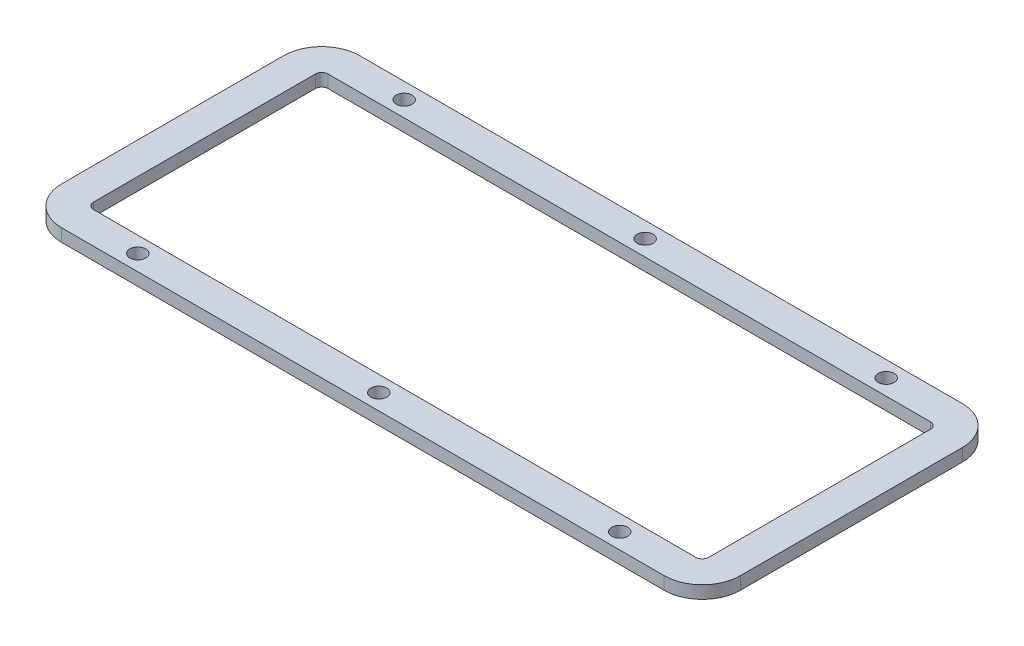
ISO-10303-21;
HEADER;
FILE_DESCRIPTION(('STEP AP214'),'2;1');
FILE_NAME('part.step','',(''),(''),'','','');
FILE_SCHEMA(('AUTOMOTIVE_DESIGN { 1 0 10303 214 1 1 1 1 }'));
ENDSEC;
DATA;
#1=APPLICATION_CONTEXT('core data for automotive mechanical design processes');
#2=APPLICATION_PROTOCOL_DEFINITION('international standard','automotive_design',2000,#1);
#3=PRODUCT_CONTEXT('',#1,'mechanical');
#4=PRODUCT('Part','Part','',(#3));
#5=PRODUCT_RELATED_PRODUCT_CATEGORY('part','',(#4));
#6=PRODUCT_DEFINITION_FORMATION('','',#4);
#7=PRODUCT_DEFINITION_CONTEXT('part definition',#1,'design');
#8=PRODUCT_DEFINITION('design','',#6,#7);
#9=PRODUCT_DEFINITION_SHAPE('','',#8);
#10=(LENGTH_UNIT() NAMED_UNIT(*) SI_UNIT(.MILLI.,.METRE.));
#11=(NAMED_UNIT(*) PLANE_ANGLE_UNIT() SI_UNIT($,.RADIAN.));
#12=(NAMED_UNIT(*) SI_UNIT($,.STERADIAN.) SOLID_ANGLE_UNIT());
#13=UNCERTAINTY_MEASURE_WITH_UNIT(LENGTH_MEASURE(1.E-05),#10,'distance_accuracy_value','');
#14=(GEOMETRIC_REPRESENTATION_CONTEXT(3) GLOBAL_UNCERTAINTY_ASSIGNED_CONTEXT((#13)) GLOBAL_UNIT_ASSIGNED_CONTEXT((#10,
#11,#12)) REPRESENTATION_CONTEXT('',''));
#15=CARTESIAN_POINT('',(0.,0.,0.));
#16=DIRECTION('',(0.,0.,1.));
#17=DIRECTION('',(1.,0.,0.));
#18=AXIS2_PLACEMENT_3D('',#15,#16,#17);
#19=CARTESIAN_POINT('',(-169.8625,3.175,74.6125));
#20=DIRECTION('',(0.,1.,0.));
#21=DIRECTION('',(0.,0.,1.));
#22=AXIS2_PLACEMENT_3D('',#19,#20,#21);
#23=PLANE('',#22);
#24=DIRECTION('',(0.,0.,-1.));
#25=VECTOR('',#24,1.);
#26=CARTESIAN_POINT('',(-153.9875,3.175,58.7375));
#27=LINE('',#26,#25);
#28=CARTESIAN_POINT('',(-153.9875,3.175,-55.5625));
#29=VERTEX_POINT('',#28);
#30=CARTESIAN_POINT('',(-153.9875,3.175,55.5625));
#31=VERTEX_POINT('',#30);
#32=EDGE_CURVE('E162',#29,#31,#27,.F.);
#33=ORIENTED_EDGE('',*,*,#32,.F.);
#34=CARTESIAN_POINT('',(-150.8125,3.175,-55.5625));
#35=DIRECTION('',(0.,1.,0.));
#36=DIRECTION('',(0.,0.,1.));
#37=AXIS2_PLACEMENT_3D('',#34,#35,#36);
#38=CIRCLE('',#37,3.175);
#39=CARTESIAN_POINT('',(-150.8125,3.175,-58.7375));
#40=VERTEX_POINT('',#39);
#41=EDGE_CURVE('E161',#29,#40,#38,.F.);
#42=ORIENTED_EDGE('',*,*,#41,.T.);
#43=DIRECTION('',(1.,0.,0.));
#44=VECTOR('',#43,1.);
#45=CARTESIAN_POINT('',(-153.9875,3.175,-58.7375));
#46=LINE('',#45,#44);
#47=CARTESIAN_POINT('',(150.8125,3.175,-58.7375));
#48=VERTEX_POINT('',#47);
#49=EDGE_CURVE('E158',#48,#40,#46,.F.);
#50=ORIENTED_EDGE('',*,*,#49,.F.);
#51=CARTESIAN_POINT('',(150.8125,3.175,-55.5625));
#52=DIRECTION('',(0.,1.,0.));
#53=DIRECTION('',(0.,0.,1.));
#54=AXIS2_PLACEMENT_3D('',#51,#52,#53);
#55=CIRCLE('',#54,3.175);
#56=CARTESIAN_POINT('',(153.9875,3.175,-55.5625));
#57=VERTEX_POINT('',#56);
#58=EDGE_CURVE('E227',#48,#57,#55,.F.);
#59=ORIENTED_EDGE('',*,*,#58,.T.);
#60=DIRECTION('',(0.,0.,1.));
#61=VECTOR('',#60,1.);
#62=CARTESIAN_POINT('',(153.9875,3.175,-58.7375));
#63=LINE('',#62,#61);
#64=CARTESIAN_POINT('',(153.9875,3.175,55.5625));
#65=VERTEX_POINT('',#64);
#66=EDGE_CURVE('E155',#65,#57,#63,.F.);
#67=ORIENTED_EDGE('',*,*,#66,.F.);
#68=CARTESIAN_POINT('',(150.8125,3.175,55.5625));
#69=DIRECTION('',(0.,1.,0.));
#70=DIRECTION('',(0.,0.,1.));
#71=AXIS2_PLACEMENT_3D('',#68,#69,#70);
#72=CIRCLE('',#71,3.175);
#73=CARTESIAN_POINT('',(150.8125,3.175,58.7375));
#74=VERTEX_POINT('',#73);
#75=EDGE_CURVE('E169',#65,#74,#72,.F.);
#76=ORIENTED_EDGE('',*,*,#75,.T.);
#77=DIRECTION('',(-1.,0.,0.));
#78=VECTOR('',#77,1.);
#79=CARTESIAN_POINT('',(153.9875,3.175,58.7375));
#80=LINE('',#79,#78);
#81=CARTESIAN_POINT('',(-150.8125,3.175,58.7375));
#82=VERTEX_POINT('',#81);
#83=EDGE_CURVE('E166',#82,#74,#80,.F.);
#84=ORIENTED_EDGE('',*,*,#83,.F.);
#85=CARTESIAN_POINT('',(-150.8125,3.175,55.5625));
#86=DIRECTION('',(0.,1.,0.));
#87=DIRECTION('',(0.,0.,1.));
#88=AXIS2_PLACEMENT_3D('',#85,#86,#87);
#89=CIRCLE('',#88,3.175);
#90=EDGE_CURVE('E165',#82,#31,#89,.F.);
#91=ORIENTED_EDGE('',*,*,#90,.T.);
#92=EDGE_LOOP('',(#33,#42,#50,#59,#67,#76,#84,#91));
#93=FACE_BOUND('',#92,.T.);
#94=DIRECTION('',(0.,0.,-1.));
#95=VECTOR('',#94,1.);
#96=CARTESIAN_POINT('',(-169.8625,3.175,74.6125));
#97=LINE('',#96,#95);
#98=CARTESIAN_POINT('',(-169.8625,3.175,-55.5625));
#99=VERTEX_POINT('',#98);
#100=CARTESIAN_POINT('',(-169.8625,3.175,55.5625));
#101=VERTEX_POINT('',#100);
#102=EDGE_CURVE('E177',#99,#101,#97,.F.);
#103=ORIENTED_EDGE('',*,*,#102,.T.);
#104=CARTESIAN_POINT('',(-150.8125,3.175,55.5625));
#105=DIRECTION('',(0.,-1.,0.));
#106=DIRECTION('',(0.,0.,-1.));
#107=AXIS2_PLACEMENT_3D('',#104,#105,#106);
#108=CIRCLE('',#107,19.05);
#109=CARTESIAN_POINT('',(-150.8125,3.175,74.6124999999999));
#110=VERTEX_POINT('',#109);
#111=EDGE_CURVE('E178',#110,#101,#108,.T.);
#112=ORIENTED_EDGE('',*,*,#111,.F.);
#113=DIRECTION('',(-1.,0.,0.));
#114=VECTOR('',#113,1.);
#115=CARTESIAN_POINT('',(169.8625,3.175,74.6125));
#116=LINE('',#115,#114);
#117=CARTESIAN_POINT('',(150.8125,3.175,74.6125));
#118=VERTEX_POINT('',#117);
#119=EDGE_CURVE('E172',#110,#118,#116,.F.);
#120=ORIENTED_EDGE('',*,*,#119,.T.);
#121=CARTESIAN_POINT('',(150.8125,3.175,55.5625));
#122=DIRECTION('',(0.,-1.,0.));
#123=DIRECTION('',(0.,0.,-1.));
#124=AXIS2_PLACEMENT_3D('',#121,#122,#123);
#125=CIRCLE('',#124,19.05);
#126=CARTESIAN_POINT('',(169.8625,3.175,55.5625));
#127=VERTEX_POINT('',#126);
#128=EDGE_CURVE('E175',#127,#118,#125,.T.);
#129=ORIENTED_EDGE('',*,*,#128,.F.);
#130=DIRECTION('',(0.,0.,1.));
#131=VECTOR('',#130,1.);
#132=CARTESIAN_POINT('',(169.8625,3.175,-74.6125));
#133=LINE('',#132,#131);
#134=CARTESIAN_POINT('',(169.8625,3.175,-55.5625));
#135=VERTEX_POINT('',#134);
#136=EDGE_CURVE('E133',#127,#135,#133,.F.);
#137=ORIENTED_EDGE('',*,*,#136,.T.);
#138=CARTESIAN_POINT('',(150.8125,3.175,-55.5625));
#139=DIRECTION('',(0.,-1.,0.));
#140=DIRECTION('',(0.,0.,-1.));
#141=AXIS2_PLACEMENT_3D('',#138,#139,#140);
#142=CIRCLE('',#141,19.05);
#143=CARTESIAN_POINT('',(150.8125,3.175,-74.6125));
#144=VERTEX_POINT('',#143);
#145=EDGE_CURVE('E126',#144,#135,#142,.T.);
#146=ORIENTED_EDGE('',*,*,#145,.F.);
#147=DIRECTION('',(1.,0.,0.));
#148=VECTOR('',#147,1.);
#149=CARTESIAN_POINT('',(-169.8625,3.175,-74.6125));
#150=LINE('',#149,#148);
#151=CARTESIAN_POINT('',(-150.8125,3.175,-74.6125));
#152=VERTEX_POINT('',#151);
#153=EDGE_CURVE('E130',#144,#152,#150,.F.);
#154=ORIENTED_EDGE('',*,*,#153,.T.);
#155=CARTESIAN_POINT('',(-150.8125,3.175,-55.5625));
#156=DIRECTION('',(0.,-1.,0.));
#157=DIRECTION('',(0.,0.,-1.));
#158=AXIS2_PLACEMENT_3D('',#155,#156,#157);
#159=CIRCLE('',#158,19.05);
#160=EDGE_CURVE('E146',#99,#152,#159,.T.);
#161=ORIENTED_EDGE('',*,*,#160,.F.);
#162=EDGE_LOOP('',(#103,#112,#120,#129,#137,#146,#154,#161));
#163=FACE_BOUND('',#162,.T.);
#164=CARTESIAN_POINT('',(-120.6373,3.17499999999998,66.6877));
#165=DIRECTION('',(0.,1.,0.));
#166=DIRECTION('',(0.,0.,1.));
#167=AXIS2_PLACEMENT_3D('',#164,#165,#166);
#168=CIRCLE('',#167,3.9751);
#169=CARTESIAN_POINT('',(-120.6373,3.17499999999998,70.6628));
#170=VERTEX_POINT('',#169);
#171=EDGE_CURVE('E139',#170,#170,#168,.F.);
#172=ORIENTED_EDGE('',*,*,#171,.T.);
#173=EDGE_LOOP('',(#172));
#174=FACE_BOUND('',#173,.T.);
#175=CARTESIAN_POINT('',(-0.0126999999999868,3.17499999999998,66.6877));
#176=DIRECTION('',(0.,1.,0.));
#177=DIRECTION('',(0.,0.,1.));
#178=AXIS2_PLACEMENT_3D('',#175,#176,#177);
#179=CIRCLE('',#178,3.9751);
#180=CARTESIAN_POINT('',(-0.0126999999999868,3.17499999999998,70.6628));
#181=VERTEX_POINT('',#180);
#182=EDGE_CURVE('E246',#181,#181,#179,.F.);
#183=ORIENTED_EDGE('',*,*,#182,.T.);
#184=EDGE_LOOP('',(#183));
#185=FACE_BOUND('',#184,.T.);
#186=CARTESIAN_POINT('',(-0.0126999999999697,3.17499999999998,-66.6623));
#187=DIRECTION('',(0.,1.,0.));
#188=DIRECTION('',(0.,0.,1.));
#189=AXIS2_PLACEMENT_3D('',#186,#187,#188);
#190=CIRCLE('',#189,3.9751);
#191=CARTESIAN_POINT('',(-0.0126999999999697,3.17499999999998,-62.6872));
#192=VERTEX_POINT('',#191);
#193=EDGE_CURVE('E249',#192,#192,#190,.F.);
#194=ORIENTED_EDGE('',*,*,#193,.T.);
#195=EDGE_LOOP('',(#194));
#196=FACE_BOUND('',#195,.T.);
#197=CARTESIAN_POINT('',(-120.6373,3.17499999999998,-66.6623));
#198=DIRECTION('',(0.,1.,0.));
#199=DIRECTION('',(0.,0.,1.));
#200=AXIS2_PLACEMENT_3D('',#197,#198,#199);
#201=CIRCLE('',#200,3.9751);
#202=CARTESIAN_POINT('',(-120.6373,3.17499999999998,-62.6872));
#203=VERTEX_POINT('',#202);
#204=EDGE_CURVE('E252',#203,#203,#201,.F.);
#205=ORIENTED_EDGE('',*,*,#204,.T.);
#206=EDGE_LOOP('',(#205));
#207=FACE_BOUND('',#206,.T.);
#208=CARTESIAN_POINT('',(120.6373,3.17499999999998,-66.6623));
#209=DIRECTION('',(0.,1.,0.));
#210=DIRECTION('',(0.,0.,1.));
#211=AXIS2_PLACEMENT_3D('',#208,#209,#210);
#212=CIRCLE('',#211,3.9751);
#213=CARTESIAN_POINT('',(120.6373,3.17499999999998,-62.6872));
#214=VERTEX_POINT('',#213);
#215=EDGE_CURVE('E254',#214,#214,#212,.F.);
#216=ORIENTED_EDGE('',*,*,#215,.T.);
#217=EDGE_LOOP('',(#216));
#218=FACE_BOUND('',#217,.T.);
#219=CARTESIAN_POINT('',(120.6373,3.17499999999998,66.6877));
#220=DIRECTION('',(0.,1.,0.));
#221=DIRECTION('',(0.,0.,1.));
#222=AXIS2_PLACEMENT_3D('',#219,#220,#221);
#223=CIRCLE('',#222,3.9751);
#224=CARTESIAN_POINT('',(120.6373,3.17499999999998,70.6628));
#225=VERTEX_POINT('',#224);
#226=EDGE_CURVE('E19',#225,#225,#223,.F.);
#227=ORIENTED_EDGE('',*,*,#226,.T.);
#228=EDGE_LOOP('',(#227));
#229=FACE_BOUND('',#228,.T.);
#230=ADVANCED_FACE('F16',(#93,#163,#174,#185,#196,#207,#218,#229),#23,.T.);
#231=CARTESIAN_POINT('',(120.6373,367.933473023724,66.6877));
#232=DIRECTION('',(0.,1.,0.));
#233=DIRECTION('',(0.,0.,1.));
#234=AXIS2_PLACEMENT_3D('',#231,#232,#233);
#235=CYLINDRICAL_SURFACE('',#234,3.9751);
#236=ORIENTED_EDGE('',*,*,#226,.F.);
#237=EDGE_LOOP('',(#236));
#238=FACE_BOUND('',#237,.T.);
#239=CARTESIAN_POINT('',(120.6373,-3.17499999999998,66.6877));
#240=DIRECTION('',(0.,1.,0.));
#241=DIRECTION('',(0.,0.,1.));
#242=AXIS2_PLACEMENT_3D('',#239,#240,#241);
#243=CIRCLE('',#242,3.9751);
#244=CARTESIAN_POINT('',(120.6373,-3.17499999999998,70.6628));
#245=VERTEX_POINT('',#244);
#246=EDGE_CURVE('E224',#245,#245,#243,.F.);
#247=ORIENTED_EDGE('',*,*,#246,.T.);
#248=EDGE_LOOP('',(#247));
#249=FACE_BOUND('',#248,.T.);
#250=ADVANCED_FACE('F262',(#238,#249),#235,.F.);
#251=CARTESIAN_POINT('',(120.6373,367.933473023724,-66.6623));
#252=DIRECTION('',(0.,1.,0.));
#253=DIRECTION('',(0.,0.,1.));
#254=AXIS2_PLACEMENT_3D('',#251,#252,#253);
#255=CYLINDRICAL_SURFACE('',#254,3.9751);
#256=ORIENTED_EDGE('',*,*,#215,.F.);
#257=EDGE_LOOP('',(#256));
#258=FACE_BOUND('',#257,.T.);
#259=CARTESIAN_POINT('',(120.6373,-3.17499999999998,-66.6623));
#260=DIRECTION('',(0.,1.,0.));
#261=DIRECTION('',(0.,0.,1.));
#262=AXIS2_PLACEMENT_3D('',#259,#260,#261);
#263=CIRCLE('',#262,3.9751);
#264=CARTESIAN_POINT('',(120.6373,-3.17499999999998,-62.6872));
#265=VERTEX_POINT('',#264);
#266=EDGE_CURVE('E221',#265,#265,#263,.F.);
#267=ORIENTED_EDGE('',*,*,#266,.T.);
#268=EDGE_LOOP('',(#267));
#269=FACE_BOUND('',#268,.T.);
#270=ADVANCED_FACE('F265',(#258,#269),#255,.F.);
#271=CARTESIAN_POINT('',(-120.6373,367.933473023724,-66.6623));
#272=DIRECTION('',(0.,1.,0.));
#273=DIRECTION('',(0.,0.,1.));
#274=AXIS2_PLACEMENT_3D('',#271,#272,#273);
#275=CYLINDRICAL_SURFACE('',#274,3.9751);
#276=ORIENTED_EDGE('',*,*,#204,.F.);
#277=EDGE_LOOP('',(#276));
#278=FACE_BOUND('',#277,.T.);
#279=CARTESIAN_POINT('',(-120.6373,-3.17499999999998,-66.6623));
#280=DIRECTION('',(0.,1.,0.));
#281=DIRECTION('',(0.,0.,1.));
#282=AXIS2_PLACEMENT_3D('',#279,#280,#281);
#283=CIRCLE('',#282,3.9751);
#284=CARTESIAN_POINT('',(-120.6373,-3.17499999999998,-62.6872));
#285=VERTEX_POINT('',#284);
#286=EDGE_CURVE('E218',#285,#285,#283,.F.);
#287=ORIENTED_EDGE('',*,*,#286,.T.);
#288=EDGE_LOOP('',(#287));
#289=FACE_BOUND('',#288,.T.);
#290=ADVANCED_FACE('F348',(#278,#289),#275,.F.);
#291=CARTESIAN_POINT('',(-0.0126999999999697,367.933473023724,-66.6623));
#292=DIRECTION('',(0.,1.,0.));
#293=DIRECTION('',(0.,0.,1.));
#294=AXIS2_PLACEMENT_3D('',#291,#292,#293);
#295=CYLINDRICAL_SURFACE('',#294,3.9751);
#296=ORIENTED_EDGE('',*,*,#193,.F.);
#297=EDGE_LOOP('',(#296));
#298=FACE_BOUND('',#297,.T.);
#299=CARTESIAN_POINT('',(-0.0126999999999697,-3.17499999999998,-66.6623));
#300=DIRECTION('',(0.,1.,0.));
#301=DIRECTION('',(0.,0.,1.));
#302=AXIS2_PLACEMENT_3D('',#299,#300,#301);
#303=CIRCLE('',#302,3.9751);
#304=CARTESIAN_POINT('',(-0.0126999999999697,-3.17499999999998,-62.6872));
#305=VERTEX_POINT('',#304);
#306=EDGE_CURVE('E215',#305,#305,#303,.F.);
#307=ORIENTED_EDGE('',*,*,#306,.T.);
#308=EDGE_LOOP('',(#307));
#309=FACE_BOUND('',#308,.T.);
#310=ADVANCED_FACE('F344',(#298,#309),#295,.F.);
#311=CARTESIAN_POINT('',(-0.0126999999999868,367.933473023724,66.6877));
#312=DIRECTION('',(0.,1.,0.));
#313=DIRECTION('',(0.,0.,1.));
#314=AXIS2_PLACEMENT_3D('',#311,#312,#313);
#315=CYLINDRICAL_SURFACE('',#314,3.9751);
#316=ORIENTED_EDGE('',*,*,#182,.F.);
#317=EDGE_LOOP('',(#316));
#318=FACE_BOUND('',#317,.T.);
#319=CARTESIAN_POINT('',(-0.0126999999999868,-3.17499999999998,66.6877));
#320=DIRECTION('',(0.,1.,0.));
#321=DIRECTION('',(0.,0.,1.));
#322=AXIS2_PLACEMENT_3D('',#319,#320,#321);
#323=CIRCLE('',#322,3.9751);
#324=CARTESIAN_POINT('',(-0.0126999999999868,-3.17499999999998,70.6628));
#325=VERTEX_POINT('',#324);
#326=EDGE_CURVE('E212',#325,#325,#323,.F.);
#327=ORIENTED_EDGE('',*,*,#326,.T.);
#328=EDGE_LOOP('',(#327));
#329=FACE_BOUND('',#328,.T.);
#330=ADVANCED_FACE('F340',(#318,#329),#315,.F.);
#331=CARTESIAN_POINT('',(-120.6373,367.933473023724,66.6877));
#332=DIRECTION('',(0.,1.,0.));
#333=DIRECTION('',(0.,0.,1.));
#334=AXIS2_PLACEMENT_3D('',#331,#332,#333);
#335=CYLINDRICAL_SURFACE('',#334,3.9751);
#336=ORIENTED_EDGE('',*,*,#171,.F.);
#337=EDGE_LOOP('',(#336));
#338=FACE_BOUND('',#337,.T.);
#339=CARTESIAN_POINT('',(-120.6373,-3.17499999999998,66.6877));
#340=DIRECTION('',(0.,1.,0.));
#341=DIRECTION('',(0.,0.,1.));
#342=AXIS2_PLACEMENT_3D('',#339,#340,#341);
#343=CIRCLE('',#342,3.9751);
#344=CARTESIAN_POINT('',(-120.6373,-3.17499999999998,70.6628));
#345=VERTEX_POINT('',#344);
#346=EDGE_CURVE('E209',#345,#345,#343,.F.);
#347=ORIENTED_EDGE('',*,*,#346,.T.);
#348=EDGE_LOOP('',(#347));
#349=FACE_BOUND('',#348,.T.);
#350=ADVANCED_FACE('F337',(#338,#349),#335,.F.);
#351=CARTESIAN_POINT('',(150.8125,-3.175,-55.5625));
#352=DIRECTION('',(0.,-1.,0.));
#353=DIRECTION('',(0.,0.,-1.));
#354=AXIS2_PLACEMENT_3D('',#351,#352,#353);
#355=CYLINDRICAL_SURFACE('',#354,19.05);
#356=ORIENTED_EDGE('',*,*,#145,.T.);
#357=DIRECTION('',(0.,1.,0.));
#358=VECTOR('',#357,1.);
#359=CARTESIAN_POINT('',(169.8625,-3.175,-55.5625));
#360=LINE('',#359,#358);
#361=CARTESIAN_POINT('',(169.8625,-3.175,-55.5625));
#362=VERTEX_POINT('',#361);
#363=EDGE_CURVE('E578',#135,#362,#360,.F.);
#364=ORIENTED_EDGE('',*,*,#363,.T.);
#365=CARTESIAN_POINT('',(150.8125,-3.175,-55.5625));
#366=DIRECTION('',(0.,-1.,0.));
#367=DIRECTION('',(0.,0.,-1.));
#368=AXIS2_PLACEMENT_3D('',#365,#366,#367);
#369=CIRCLE('',#368,19.05);
#370=CARTESIAN_POINT('',(150.8125,-3.175,-74.6125));
#371=VERTEX_POINT('',#370);
#372=EDGE_CURVE('E150',#362,#371,#369,.F.);
#373=ORIENTED_EDGE('',*,*,#372,.T.);
#374=DIRECTION('',(0.,1.,0.));
#375=VECTOR('',#374,1.);
#376=CARTESIAN_POINT('',(150.8125,-3.175,-74.6125));
#377=LINE('',#376,#375);
#378=EDGE_CURVE('E138',#371,#144,#377,.T.);
#379=ORIENTED_EDGE('',*,*,#378,.T.);
#380=EDGE_LOOP('',(#356,#364,#373,#379));
#381=FACE_BOUND('',#380,.T.);
#382=ADVANCED_FACE('F149',(#381),#355,.T.);
#383=CARTESIAN_POINT('',(-169.8625,-3.175,-74.6125));
#384=DIRECTION('',(0.,0.,1.));
#385=DIRECTION('',(1.,0.,0.));
#386=AXIS2_PLACEMENT_3D('',#383,#384,#385);
#387=PLANE('',#386);
#388=ORIENTED_EDGE('',*,*,#378,.F.);
#389=DIRECTION('',(1.,0.,0.));
#390=VECTOR('',#389,1.);
#391=CARTESIAN_POINT('',(-169.8625,-3.175,-74.6125));
#392=LINE('',#391,#390);
#393=CARTESIAN_POINT('',(-150.8125,-3.175,-74.6125));
#394=VERTEX_POINT('',#393);
#395=EDGE_CURVE('E207',#371,#394,#392,.F.);
#396=ORIENTED_EDGE('',*,*,#395,.T.);
#397=DIRECTION('',(0.,-1.,0.));
#398=VECTOR('',#397,1.);
#399=CARTESIAN_POINT('',(-150.8125,-3.175,-74.6125));
#400=LINE('',#399,#398);
#401=EDGE_CURVE('E145',#152,#394,#400,.T.);
#402=ORIENTED_EDGE('',*,*,#401,.F.);
#403=ORIENTED_EDGE('',*,*,#153,.F.);
#404=EDGE_LOOP('',(#388,#396,#402,#403));
#405=FACE_BOUND('',#404,.T.);
#406=ADVANCED_FACE('F142',(#405),#387,.F.);
#407=CARTESIAN_POINT('',(-150.8125,-3.175,-55.5625));
#408=DIRECTION('',(0.,-1.,0.));
#409=DIRECTION('',(0.,0.,-1.));
#410=AXIS2_PLACEMENT_3D('',#407,#408,#409);
#411=CYLINDRICAL_SURFACE('',#410,19.05);
#412=ORIENTED_EDGE('',*,*,#160,.T.);
#413=ORIENTED_EDGE('',*,*,#401,.T.);
#414=CARTESIAN_POINT('',(-150.8125,-3.175,-55.5625));
#415=DIRECTION('',(0.,-1.,0.));
#416=DIRECTION('',(0.,0.,-1.));
#417=AXIS2_PLACEMENT_3D('',#414,#415,#416);
#418=CIRCLE('',#417,19.05);
#419=CARTESIAN_POINT('',(-169.8625,-3.175,-55.5625));
#420=VERTEX_POINT('',#419);
#421=EDGE_CURVE('E204',#394,#420,#418,.F.);
#422=ORIENTED_EDGE('',*,*,#421,.T.);
#423=DIRECTION('',(0.,1.,0.));
#424=VECTOR('',#423,1.);
#425=CARTESIAN_POINT('',(-169.8625,-3.175,-55.5625));
#426=LINE('',#425,#424);
#427=EDGE_CURVE('E179',#420,#99,#426,.T.);
#428=ORIENTED_EDGE('',*,*,#427,.T.);
#429=EDGE_LOOP('',(#412,#413,#422,#428));
#430=FACE_BOUND('',#429,.T.);
#431=ADVANCED_FACE('F328',(#430),#411,.T.);
#432=CARTESIAN_POINT('',(-169.8625,-3.175,74.6125));
#433=DIRECTION('',(1.,0.,0.));
#434=DIRECTION('',(0.,0.,-1.));
#435=AXIS2_PLACEMENT_3D('',#432,#433,#434);
#436=PLANE('',#435);
#437=ORIENTED_EDGE('',*,*,#427,.F.);
#438=DIRECTION('',(0.,0.,1.));
#439=VECTOR('',#438,1.);
#440=CARTESIAN_POINT('',(-169.8625,-3.175,74.6125));
#441=LINE('',#440,#439);
#442=CARTESIAN_POINT('',(-169.8625,-3.175,55.5625));
#443=VERTEX_POINT('',#442);
#444=EDGE_CURVE('E203',#420,#443,#441,.T.);
#445=ORIENTED_EDGE('',*,*,#444,.T.);
#446=DIRECTION('',(0.,-1.,0.));
#447=VECTOR('',#446,1.);
#448=CARTESIAN_POINT('',(-169.8625,-3.175,55.5625));
#449=LINE('',#448,#447);
#450=EDGE_CURVE('E242',#101,#443,#449,.T.);
#451=ORIENTED_EDGE('',*,*,#450,.F.);
#452=ORIENTED_EDGE('',*,*,#102,.F.);
#453=EDGE_LOOP('',(#437,#445,#451,#452));
#454=FACE_BOUND('',#453,.T.);
#455=ADVANCED_FACE('F324',(#454),#436,.F.);
#456=CARTESIAN_POINT('',(-150.8125,-3.175,55.5625));
#457=DIRECTION('',(0.,-1.,0.));
#458=DIRECTION('',(0.,0.,-1.));
#459=AXIS2_PLACEMENT_3D('',#456,#457,#458);
#460=CYLINDRICAL_SURFACE('',#459,19.05);
#461=ORIENTED_EDGE('',*,*,#111,.T.);
#462=ORIENTED_EDGE('',*,*,#450,.T.);
#463=CARTESIAN_POINT('',(-150.8125,-3.175,55.5625));
#464=DIRECTION('',(0.,-1.,0.));
#465=DIRECTION('',(0.,0.,-1.));
#466=AXIS2_PLACEMENT_3D('',#463,#464,#465);
#467=CIRCLE('',#466,19.05);
#468=CARTESIAN_POINT('',(-150.8125,-3.175,74.6125));
#469=VERTEX_POINT('',#468);
#470=EDGE_CURVE('E200',#443,#469,#467,.F.);
#471=ORIENTED_EDGE('',*,*,#470,.T.);
#472=DIRECTION('',(0.,1.,0.));
#473=VECTOR('',#472,1.);
#474=CARTESIAN_POINT('',(-150.8125,-3.175,74.6124999999999));
#475=LINE('',#474,#473);
#476=EDGE_CURVE('E176',#469,#110,#475,.T.);
#477=ORIENTED_EDGE('',*,*,#476,.T.);
#478=EDGE_LOOP('',(#461,#462,#471,#477));
#479=FACE_BOUND('',#478,.T.);
#480=ADVANCED_FACE('F320',(#479),#460,.T.);
#481=CARTESIAN_POINT('',(169.8625,-3.175,74.6125));
#482=DIRECTION('',(0.,0.,-1.));
#483=DIRECTION('',(-1.,0.,0.));
#484=AXIS2_PLACEMENT_3D('',#481,#482,#483);
#485=PLANE('',#484);
#486=DIRECTION('',(0.,-1.,0.));
#487=VECTOR('',#486,1.);
#488=CARTESIAN_POINT('',(150.8125,-3.175,74.6125));
#489=LINE('',#488,#487);
#490=CARTESIAN_POINT('',(150.8125,-3.175,74.6125));
#491=VERTEX_POINT('',#490);
#492=EDGE_CURVE('E240',#118,#491,#489,.T.);
#493=ORIENTED_EDGE('',*,*,#492,.F.);
#494=ORIENTED_EDGE('',*,*,#119,.F.);
#495=ORIENTED_EDGE('',*,*,#476,.F.);
#496=DIRECTION('',(1.,0.,0.));
#497=VECTOR('',#496,1.);
#498=CARTESIAN_POINT('',(-169.8625,-3.175,74.6125));
#499=LINE('',#498,#497);
#500=EDGE_CURVE('E199',#469,#491,#499,.T.);
#501=ORIENTED_EDGE('',*,*,#500,.T.);
#502=EDGE_LOOP('',(#493,#494,#495,#501));
#503=FACE_BOUND('',#502,.T.);
#504=ADVANCED_FACE('F316',(#503),#485,.F.);
#505=CARTESIAN_POINT('',(150.8125,-3.175,55.5625));
#506=DIRECTION('',(0.,-1.,0.));
#507=DIRECTION('',(0.,0.,-1.));
#508=AXIS2_PLACEMENT_3D('',#505,#506,#507);
#509=CYLINDRICAL_SURFACE('',#508,19.05);
#510=ORIENTED_EDGE('',*,*,#128,.T.);
#511=ORIENTED_EDGE('',*,*,#492,.T.);
#512=CARTESIAN_POINT('',(150.8125,-3.175,55.5625));
#513=DIRECTION('',(0.,-1.,0.));
#514=DIRECTION('',(0.,0.,-1.));
#515=AXIS2_PLACEMENT_3D('',#512,#513,#514);
#516=CIRCLE('',#515,19.05);
#517=CARTESIAN_POINT('',(169.8625,-3.175,55.5625));
#518=VERTEX_POINT('',#517);
#519=EDGE_CURVE('E196',#491,#518,#516,.F.);
#520=ORIENTED_EDGE('',*,*,#519,.T.);
#521=DIRECTION('',(0.,1.,0.));
#522=VECTOR('',#521,1.);
#523=CARTESIAN_POINT('',(169.8625,-3.175,55.5625));
#524=LINE('',#523,#522);
#525=EDGE_CURVE('E171',#518,#127,#524,.T.);
#526=ORIENTED_EDGE('',*,*,#525,.T.);
#527=EDGE_LOOP('',(#510,#511,#520,#526));
#528=FACE_BOUND('',#527,.T.);
#529=ADVANCED_FACE('F312',(#528),#509,.T.);
#530=CARTESIAN_POINT('',(169.8625,-3.175,-74.6125));
#531=DIRECTION('',(-1.,0.,0.));
#532=DIRECTION('',(0.,0.,1.));
#533=AXIS2_PLACEMENT_3D('',#530,#531,#532);
#534=PLANE('',#533);
#535=ORIENTED_EDGE('',*,*,#525,.F.);
#536=DIRECTION('',(0.,0.,1.));
#537=VECTOR('',#536,1.);
#538=CARTESIAN_POINT('',(169.8625,-3.175,74.6125));
#539=LINE('',#538,#537);
#540=EDGE_CURVE('E195',#518,#362,#539,.F.);
#541=ORIENTED_EDGE('',*,*,#540,.T.);
#542=ORIENTED_EDGE('',*,*,#363,.F.);
#543=ORIENTED_EDGE('',*,*,#136,.F.);
#544=EDGE_LOOP('',(#535,#541,#542,#543));
#545=FACE_BOUND('',#544,.T.);
#546=ADVANCED_FACE('F308',(#545),#534,.F.);
#547=CARTESIAN_POINT('',(150.8125,-3.175,55.5625));
#548=DIRECTION('',(0.,1.,0.));
#549=DIRECTION('',(0.,0.,1.));
#550=AXIS2_PLACEMENT_3D('',#547,#548,#549);
#551=CYLINDRICAL_SURFACE('',#550,3.175);
#552=DIRECTION('',(0.,1.,0.));
#553=VECTOR('',#552,1.);
#554=CARTESIAN_POINT('',(150.8125,-3.175,58.7375));
#555=LINE('',#554,#553);
#556=CARTESIAN_POINT('',(150.8125,-3.175,58.7375));
#557=VERTEX_POINT('',#556);
#558=EDGE_CURVE('E168',#74,#557,#555,.F.);
#559=ORIENTED_EDGE('',*,*,#558,.F.);
#560=ORIENTED_EDGE('',*,*,#75,.F.);
#561=DIRECTION('',(0.,1.,0.));
#562=VECTOR('',#561,1.);
#563=CARTESIAN_POINT('',(153.9875,-3.175,55.5625));
#564=LINE('',#563,#562);
#565=CARTESIAN_POINT('',(153.9875,-3.175,55.5625));
#566=VERTEX_POINT('',#565);
#567=EDGE_CURVE('E157',#566,#65,#564,.T.);
#568=ORIENTED_EDGE('',*,*,#567,.F.);
#569=CARTESIAN_POINT('',(150.8125,-3.175,55.5625));
#570=DIRECTION('',(0.,1.,0.));
#571=DIRECTION('',(0.,0.,1.));
#572=AXIS2_PLACEMENT_3D('',#569,#570,#571);
#573=CIRCLE('',#572,3.175);
#574=EDGE_CURVE('E192',#566,#557,#573,.F.);
#575=ORIENTED_EDGE('',*,*,#574,.T.);
#576=EDGE_LOOP('',(#559,#560,#568,#575));
#577=FACE_BOUND('',#576,.T.);
#578=ADVANCED_FACE('F304',(#577),#551,.F.);
#579=CARTESIAN_POINT('',(153.9875,-3.175,58.7375));
#580=DIRECTION('',(0.,0.,-1.));
#581=DIRECTION('',(-1.,0.,0.));
#582=AXIS2_PLACEMENT_3D('',#579,#580,#581);
#583=PLANE('',#582);
#584=DIRECTION('',(1.,0.,0.));
#585=VECTOR('',#584,1.);
#586=CARTESIAN_POINT('',(-169.8625,-3.175,58.7375));
#587=LINE('',#586,#585);
#588=CARTESIAN_POINT('',(-150.8125,-3.175,58.7375));
#589=VERTEX_POINT('',#588);
#590=EDGE_CURVE('E191',#557,#589,#587,.F.);
#591=ORIENTED_EDGE('',*,*,#590,.T.);
#592=DIRECTION('',(0.,1.,0.));
#593=VECTOR('',#592,1.);
#594=CARTESIAN_POINT('',(-150.8125,-3.175,58.7375));
#595=LINE('',#594,#593);
#596=EDGE_CURVE('E236',#589,#82,#595,.T.);
#597=ORIENTED_EDGE('',*,*,#596,.T.);
#598=ORIENTED_EDGE('',*,*,#83,.T.);
#599=ORIENTED_EDGE('',*,*,#558,.T.);
#600=EDGE_LOOP('',(#591,#597,#598,#599));
#601=FACE_BOUND('',#600,.T.);
#602=ADVANCED_FACE('F300',(#601),#583,.T.);
#603=CARTESIAN_POINT('',(-150.8125,-3.175,55.5625));
#604=DIRECTION('',(0.,1.,0.));
#605=DIRECTION('',(0.,0.,1.));
#606=AXIS2_PLACEMENT_3D('',#603,#604,#605);
#607=CYLINDRICAL_SURFACE('',#606,3.175);
#608=DIRECTION('',(0.,1.,0.));
#609=VECTOR('',#608,1.);
#610=CARTESIAN_POINT('',(-153.9875,-3.175,55.5625));
#611=LINE('',#610,#609);
#612=CARTESIAN_POINT('',(-153.9875,-3.175,55.5625));
#613=VERTEX_POINT('',#612);
#614=EDGE_CURVE('E164',#31,#613,#611,.F.);
#615=ORIENTED_EDGE('',*,*,#614,.F.);
#616=ORIENTED_EDGE('',*,*,#90,.F.);
#617=ORIENTED_EDGE('',*,*,#596,.F.);
#618=CARTESIAN_POINT('',(-150.8125,-3.175,55.5625));
#619=DIRECTION('',(0.,1.,0.));
#620=DIRECTION('',(0.,0.,1.));
#621=AXIS2_PLACEMENT_3D('',#618,#619,#620);
#622=CIRCLE('',#621,3.175);
#623=EDGE_CURVE('E188',#589,#613,#622,.F.);
#624=ORIENTED_EDGE('',*,*,#623,.T.);
#625=EDGE_LOOP('',(#615,#616,#617,#624));
#626=FACE_BOUND('',#625,.T.);
#627=ADVANCED_FACE('F296',(#626),#607,.F.);
#628=CARTESIAN_POINT('',(-153.9875,-3.175,58.7375));
#629=DIRECTION('',(1.,0.,0.));
#630=DIRECTION('',(0.,0.,-1.));
#631=AXIS2_PLACEMENT_3D('',#628,#629,#630);
#632=PLANE('',#631);
#633=ORIENTED_EDGE('',*,*,#32,.T.);
#634=ORIENTED_EDGE('',*,*,#614,.T.);
#635=DIRECTION('',(0.,0.,1.));
#636=VECTOR('',#635,1.);
#637=CARTESIAN_POINT('',(-153.9875,-3.175,74.6125));
#638=LINE('',#637,#636);
#639=CARTESIAN_POINT('',(-153.9875,-3.175,-55.5625));
#640=VERTEX_POINT('',#639);
#641=EDGE_CURVE('E187',#613,#640,#638,.F.);
#642=ORIENTED_EDGE('',*,*,#641,.T.);
#643=DIRECTION('',(0.,1.,0.));
#644=VECTOR('',#643,1.);
#645=CARTESIAN_POINT('',(-153.9875,-3.175,-55.5625));
#646=LINE('',#645,#644);
#647=EDGE_CURVE('E233',#640,#29,#646,.T.);
#648=ORIENTED_EDGE('',*,*,#647,.T.);
#649=EDGE_LOOP('',(#633,#634,#642,#648));
#650=FACE_BOUND('',#649,.T.);
#651=ADVANCED_FACE('F292',(#650),#632,.T.);
#652=CARTESIAN_POINT('',(-150.8125,-3.175,-55.5625));
#653=DIRECTION('',(0.,1.,0.));
#654=DIRECTION('',(0.,0.,1.));
#655=AXIS2_PLACEMENT_3D('',#652,#653,#654);
#656=CYLINDRICAL_SURFACE('',#655,3.175);
#657=DIRECTION('',(0.,1.,0.));
#658=VECTOR('',#657,1.);
#659=CARTESIAN_POINT('',(-150.8125,-3.175,-58.7375));
#660=LINE('',#659,#658);
#661=CARTESIAN_POINT('',(-150.8125,-3.175,-58.7375));
#662=VERTEX_POINT('',#661);
#663=EDGE_CURVE('E160',#40,#662,#660,.F.);
#664=ORIENTED_EDGE('',*,*,#663,.F.);
#665=ORIENTED_EDGE('',*,*,#41,.F.);
#666=ORIENTED_EDGE('',*,*,#647,.F.);
#667=CARTESIAN_POINT('',(-150.8125,-3.175,-55.5625));
#668=DIRECTION('',(0.,1.,0.));
#669=DIRECTION('',(0.,0.,1.));
#670=AXIS2_PLACEMENT_3D('',#667,#668,#669);
#671=CIRCLE('',#670,3.175);
#672=EDGE_CURVE('E184',#640,#662,#671,.F.);
#673=ORIENTED_EDGE('',*,*,#672,.T.);
#674=EDGE_LOOP('',(#664,#665,#666,#673));
#675=FACE_BOUND('',#674,.T.);
#676=ADVANCED_FACE('F288',(#675),#656,.F.);
#677=CARTESIAN_POINT('',(-153.9875,-3.175,-58.7375));
#678=DIRECTION('',(0.,0.,1.));
#679=DIRECTION('',(1.,0.,0.));
#680=AXIS2_PLACEMENT_3D('',#677,#678,#679);
#681=PLANE('',#680);
#682=ORIENTED_EDGE('',*,*,#49,.T.);
#683=ORIENTED_EDGE('',*,*,#663,.T.);
#684=DIRECTION('',(1.,0.,0.));
#685=VECTOR('',#684,1.);
#686=CARTESIAN_POINT('',(-169.8625,-3.175,-58.7375));
#687=LINE('',#686,#685);
#688=CARTESIAN_POINT('',(150.8125,-3.175,-58.7375));
#689=VERTEX_POINT('',#688);
#690=EDGE_CURVE('E183',#662,#689,#687,.T.);
#691=ORIENTED_EDGE('',*,*,#690,.T.);
#692=DIRECTION('',(0.,1.,0.));
#693=VECTOR('',#692,1.);
#694=CARTESIAN_POINT('',(150.8125,-3.175,-58.7375));
#695=LINE('',#694,#693);
#696=EDGE_CURVE('E230',#689,#48,#695,.T.);
#697=ORIENTED_EDGE('',*,*,#696,.T.);
#698=EDGE_LOOP('',(#682,#683,#691,#697));
#699=FACE_BOUND('',#698,.T.);
#700=ADVANCED_FACE('F284',(#699),#681,.T.);
#701=CARTESIAN_POINT('',(150.8125,-3.175,-55.5625));
#702=DIRECTION('',(0.,1.,0.));
#703=DIRECTION('',(0.,0.,1.));
#704=AXIS2_PLACEMENT_3D('',#701,#702,#703);
#705=CYLINDRICAL_SURFACE('',#704,3.175);
#706=DIRECTION('',(0.,1.,0.));
#707=VECTOR('',#706,1.);
#708=CARTESIAN_POINT('',(153.9875,-3.175,-55.5625));
#709=LINE('',#708,#707);
#710=CARTESIAN_POINT('',(153.9875,-3.175,-55.5625));
#711=VERTEX_POINT('',#710);
#712=EDGE_CURVE('E33',#57,#711,#709,.F.);
#713=ORIENTED_EDGE('',*,*,#712,.F.);
#714=ORIENTED_EDGE('',*,*,#58,.F.);
#715=ORIENTED_EDGE('',*,*,#696,.F.);
#716=CARTESIAN_POINT('',(150.8125,-3.175,-55.5625));
#717=DIRECTION('',(0.,1.,0.));
#718=DIRECTION('',(0.,0.,1.));
#719=AXIS2_PLACEMENT_3D('',#716,#717,#718);
#720=CIRCLE('',#719,3.175);
#721=EDGE_CURVE('E25',#689,#711,#720,.F.);
#722=ORIENTED_EDGE('',*,*,#721,.T.);
#723=EDGE_LOOP('',(#713,#714,#715,#722));
#724=FACE_BOUND('',#723,.T.);
#725=ADVANCED_FACE('F277',(#724),#705,.F.);
#726=CARTESIAN_POINT('',(153.9875,-3.175,-58.7375));
#727=DIRECTION('',(-1.,0.,0.));
#728=DIRECTION('',(0.,0.,1.));
#729=AXIS2_PLACEMENT_3D('',#726,#727,#728);
#730=PLANE('',#729);
#731=ORIENTED_EDGE('',*,*,#66,.T.);
#732=ORIENTED_EDGE('',*,*,#712,.T.);
#733=DIRECTION('',(0.,0.,1.));
#734=VECTOR('',#733,1.);
#735=CARTESIAN_POINT('',(153.9875,-3.175,74.6125));
#736=LINE('',#735,#734);
#737=EDGE_CURVE('E11',#711,#566,#736,.T.);
#738=ORIENTED_EDGE('',*,*,#737,.T.);
#739=ORIENTED_EDGE('',*,*,#567,.T.);
#740=EDGE_LOOP('',(#731,#732,#738,#739));
#741=FACE_BOUND('',#740,.T.);
#742=ADVANCED_FACE('F270',(#741),#730,.T.);
#743=CARTESIAN_POINT('',(-169.8625,-3.175,74.6125));
#744=DIRECTION('',(0.,1.,0.));
#745=DIRECTION('',(0.,0.,1.));
#746=AXIS2_PLACEMENT_3D('',#743,#744,#745);
#747=PLANE('',#746);
#748=ORIENTED_EDGE('',*,*,#721,.F.);
#749=ORIENTED_EDGE('',*,*,#690,.F.);
#750=ORIENTED_EDGE('',*,*,#672,.F.);
#751=ORIENTED_EDGE('',*,*,#641,.F.);
#752=ORIENTED_EDGE('',*,*,#623,.F.);
#753=ORIENTED_EDGE('',*,*,#590,.F.);
#754=ORIENTED_EDGE('',*,*,#574,.F.);
#755=ORIENTED_EDGE('',*,*,#737,.F.);
#756=EDGE_LOOP('',(#748,#749,#750,#751,#752,#753,#754,#755));
#757=FACE_BOUND('',#756,.T.);
#758=ORIENTED_EDGE('',*,*,#519,.F.);
#759=ORIENTED_EDGE('',*,*,#500,.F.);
#760=ORIENTED_EDGE('',*,*,#470,.F.);
#761=ORIENTED_EDGE('',*,*,#444,.F.);
#762=ORIENTED_EDGE('',*,*,#421,.F.);
#763=ORIENTED_EDGE('',*,*,#395,.F.);
#764=ORIENTED_EDGE('',*,*,#372,.F.);
#765=ORIENTED_EDGE('',*,*,#540,.F.);
#766=EDGE_LOOP('',(#758,#759,#760,#761,#762,#763,#764,#765));
#767=FACE_BOUND('',#766,.T.);
#768=ORIENTED_EDGE('',*,*,#346,.F.);
#769=EDGE_LOOP('',(#768));
#770=FACE_BOUND('',#769,.T.);
#771=ORIENTED_EDGE('',*,*,#326,.F.);
#772=EDGE_LOOP('',(#771));
#773=FACE_BOUND('',#772,.T.);
#774=ORIENTED_EDGE('',*,*,#306,.F.);
#775=EDGE_LOOP('',(#774));
#776=FACE_BOUND('',#775,.T.);
#777=ORIENTED_EDGE('',*,*,#286,.F.);
#778=EDGE_LOOP('',(#777));
#779=FACE_BOUND('',#778,.T.);
#780=ORIENTED_EDGE('',*,*,#266,.F.);
#781=EDGE_LOOP('',(#780));
#782=FACE_BOUND('',#781,.T.);
#783=ORIENTED_EDGE('',*,*,#246,.F.);
#784=EDGE_LOOP('',(#783));
#785=FACE_BOUND('',#784,.T.);
#786=ADVANCED_FACE('F268',(#757,#767,#770,#773,#776,#779,#782,#785),#747,.F.);
#787=CLOSED_SHELL('',(#230,#250,#270,#290,#310,#330,#350,#382,#406,#431,#455,#480,#504,#529,
#546,#578,#602,#627,#651,#676,#700,#725,#742,#786));
#788=MANIFOLD_SOLID_BREP('B1',#787);
#789=ADVANCED_BREP_SHAPE_REPRESENTATION('',(#18,#788),#14);
#790=SHAPE_DEFINITION_REPRESENTATION(#9,#789);
ENDSEC;
END-ISO-10303-21;
